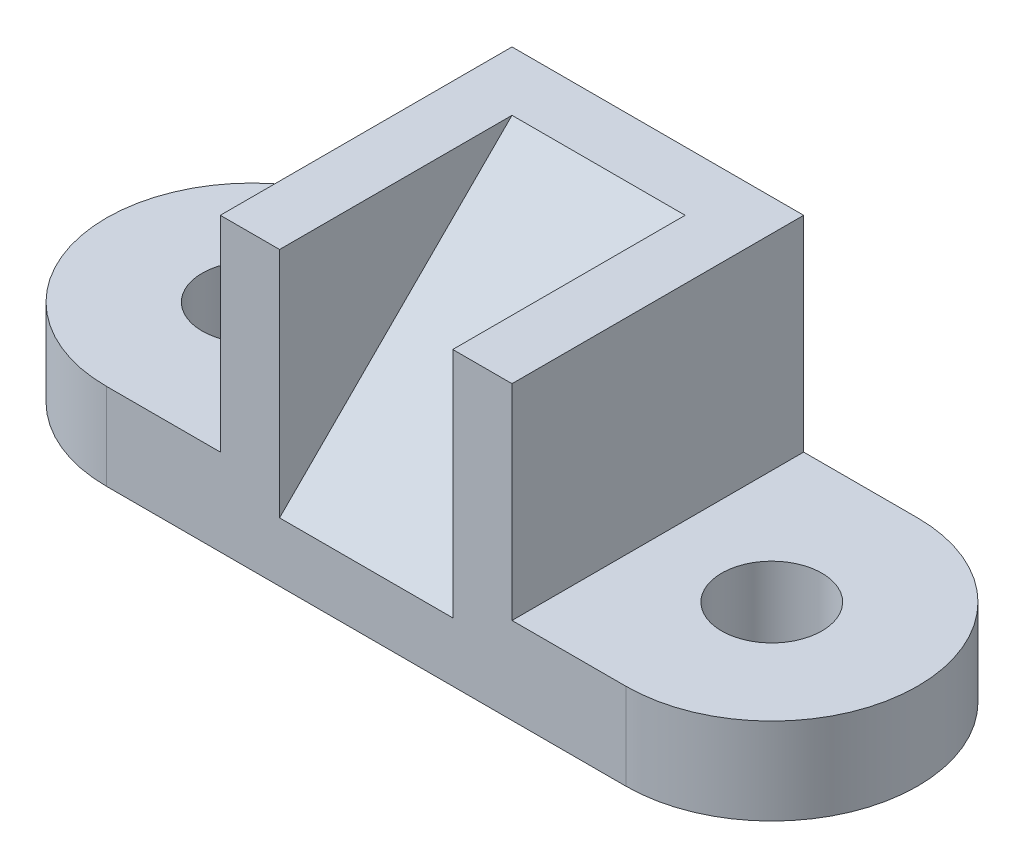
ISO-10303-21;
HEADER;
FILE_DESCRIPTION(('STEP AP214'),'2;1');
FILE_NAME('part.step','',(''),(''),'','','');
FILE_SCHEMA(('AUTOMOTIVE_DESIGN { 1 0 10303 214 1 1 1 1 }'));
ENDSEC;
DATA;
#1=APPLICATION_CONTEXT('core data for automotive mechanical design processes');
#2=APPLICATION_PROTOCOL_DEFINITION('international standard','automotive_design',2000,#1);
#3=PRODUCT_CONTEXT('',#1,'mechanical');
#4=PRODUCT('Part','Part','',(#3));
#5=PRODUCT_RELATED_PRODUCT_CATEGORY('part','',(#4));
#6=PRODUCT_DEFINITION_FORMATION('','',#4);
#7=PRODUCT_DEFINITION_CONTEXT('part definition',#1,'design');
#8=PRODUCT_DEFINITION('design','',#6,#7);
#9=PRODUCT_DEFINITION_SHAPE('','',#8);
#10=(LENGTH_UNIT() NAMED_UNIT(*) SI_UNIT(.MILLI.,.METRE.));
#11=(NAMED_UNIT(*) PLANE_ANGLE_UNIT() SI_UNIT($,.RADIAN.));
#12=(NAMED_UNIT(*) SI_UNIT($,.STERADIAN.) SOLID_ANGLE_UNIT());
#13=UNCERTAINTY_MEASURE_WITH_UNIT(LENGTH_MEASURE(1.E-05),#10,'distance_accuracy_value','');
#14=(GEOMETRIC_REPRESENTATION_CONTEXT(3) GLOBAL_UNCERTAINTY_ASSIGNED_CONTEXT((#13)) GLOBAL_UNIT_ASSIGNED_CONTEXT((#10,
#11,#12)) REPRESENTATION_CONTEXT('',''));
#15=CARTESIAN_POINT('',(0.,0.,0.));
#16=DIRECTION('',(0.,0.,1.));
#17=DIRECTION('',(1.,0.,0.));
#18=AXIS2_PLACEMENT_3D('',#15,#16,#17);
#19=CARTESIAN_POINT('',(57.,19.,0.));
#20=DIRECTION('',(0.,1.,0.));
#21=DIRECTION('',(0.,0.,1.));
#22=AXIS2_PLACEMENT_3D('',#19,#20,#21);
#23=PLANE('',#22);
#24=DIRECTION('',(0.,0.,1.));
#25=VECTOR('',#24,1.);
#26=CARTESIAN_POINT('',(-32.,19.,-32.));
#27=LINE('',#26,#25);
#28=CARTESIAN_POINT('',(-32.,19.,-32.));
#29=VERTEX_POINT('',#28);
#30=CARTESIAN_POINT('',(-32.,19.,32.));
#31=VERTEX_POINT('',#30);
#32=EDGE_CURVE('E144',#29,#31,#27,.T.);
#33=ORIENTED_EDGE('',*,*,#32,.F.);
#34=DIRECTION('',(-1.,0.,0.));
#35=VECTOR('',#34,1.);
#36=CARTESIAN_POINT('',(57.,19.,-32.));
#37=LINE('',#36,#35);
#38=CARTESIAN_POINT('',(-57.,19.,-32.));
#39=VERTEX_POINT('',#38);
#40=EDGE_CURVE('E190',#29,#39,#37,.T.);
#41=ORIENTED_EDGE('',*,*,#40,.T.);
#42=CARTESIAN_POINT('',(-57.,19.,0.));
#43=DIRECTION('',(0.,1.,0.));
#44=DIRECTION('',(0.,0.,1.));
#45=AXIS2_PLACEMENT_3D('',#42,#43,#44);
#46=CIRCLE('',#45,32.);
#47=CARTESIAN_POINT('',(-57.,19.,32.));
#48=VERTEX_POINT('',#47);
#49=EDGE_CURVE('E194',#39,#48,#46,.T.);
#50=ORIENTED_EDGE('',*,*,#49,.T.);
#51=DIRECTION('',(1.,0.,0.));
#52=VECTOR('',#51,1.);
#53=CARTESIAN_POINT('',(57.,19.,32.));
#54=LINE('',#53,#52);
#55=EDGE_CURVE('E197',#48,#31,#54,.T.);
#56=ORIENTED_EDGE('',*,*,#55,.T.);
#57=EDGE_LOOP('',(#33,#41,#50,#56));
#58=FACE_BOUND('',#57,.T.);
#59=CARTESIAN_POINT('',(-57.,19.,0.));
#60=DIRECTION('',(0.,1.,0.));
#61=DIRECTION('',(0.,0.,1.));
#62=AXIS2_PLACEMENT_3D('',#59,#60,#61);
#63=CIRCLE('',#62,11.);
#64=CARTESIAN_POINT('',(-57.,19.,11.));
#65=VERTEX_POINT('',#64);
#66=EDGE_CURVE('E181',#65,#65,#63,.T.);
#67=ORIENTED_EDGE('',*,*,#66,.F.);
#68=EDGE_LOOP('',(#67));
#69=FACE_BOUND('',#68,.T.);
#70=ADVANCED_FACE('F39',(#58,#69),#23,.T.);
#71=DIRECTION('',(0.,0.,-1.));
#72=VECTOR('',#71,1.);
#73=CARTESIAN_POINT('',(32.,19.,-32.));
#74=LINE('',#73,#72);
#75=CARTESIAN_POINT('',(32.,19.,32.));
#76=VERTEX_POINT('',#75);
#77=CARTESIAN_POINT('',(32.,19.,-32.));
#78=VERTEX_POINT('',#77);
#79=EDGE_CURVE('E62',#76,#78,#74,.T.);
#80=ORIENTED_EDGE('',*,*,#79,.F.);
#81=CARTESIAN_POINT('',(57.,19.,32.));
#82=VERTEX_POINT('',#81);
#83=EDGE_CURVE('E196',#76,#82,#54,.T.);
#84=ORIENTED_EDGE('',*,*,#83,.T.);
#85=CARTESIAN_POINT('',(57.,19.,0.));
#86=DIRECTION('',(0.,1.,0.));
#87=DIRECTION('',(0.,0.,1.));
#88=AXIS2_PLACEMENT_3D('',#85,#86,#87);
#89=CIRCLE('',#88,32.);
#90=CARTESIAN_POINT('',(57.,19.,-32.));
#91=VERTEX_POINT('',#90);
#92=EDGE_CURVE('E187',#82,#91,#89,.T.);
#93=ORIENTED_EDGE('',*,*,#92,.T.);
#94=EDGE_CURVE('E192',#91,#78,#37,.T.);
#95=ORIENTED_EDGE('',*,*,#94,.T.);
#96=EDGE_LOOP('',(#80,#84,#93,#95));
#97=FACE_BOUND('',#96,.T.);
#98=CARTESIAN_POINT('',(57.,19.,0.));
#99=DIRECTION('',(0.,1.,0.));
#100=DIRECTION('',(0.,0.,1.));
#101=AXIS2_PLACEMENT_3D('',#98,#99,#100);
#102=CIRCLE('',#101,11.);
#103=CARTESIAN_POINT('',(57.,19.,11.));
#104=VERTEX_POINT('',#103);
#105=EDGE_CURVE('E175',#104,#104,#102,.T.);
#106=ORIENTED_EDGE('',*,*,#105,.F.);
#107=EDGE_LOOP('',(#106));
#108=FACE_BOUND('',#107,.T.);
#109=ADVANCED_FACE('F232',(#97,#108),#23,.T.);
#110=CARTESIAN_POINT('',(57.,0.,0.));
#111=DIRECTION('',(0.,1.,0.));
#112=DIRECTION('',(0.,0.,1.));
#113=AXIS2_PLACEMENT_3D('',#110,#111,#112);
#114=PLANE('',#113);
#115=CARTESIAN_POINT('',(57.,0.,0.));
#116=DIRECTION('',(0.,1.,0.));
#117=DIRECTION('',(0.,0.,1.));
#118=AXIS2_PLACEMENT_3D('',#115,#116,#117);
#119=CIRCLE('',#118,32.);
#120=CARTESIAN_POINT('',(57.,0.,32.));
#121=VERTEX_POINT('',#120);
#122=CARTESIAN_POINT('',(57.,0.,-32.));
#123=VERTEX_POINT('',#122);
#124=EDGE_CURVE('E184',#121,#123,#119,.T.);
#125=ORIENTED_EDGE('',*,*,#124,.F.);
#126=DIRECTION('',(1.,0.,0.));
#127=VECTOR('',#126,1.);
#128=CARTESIAN_POINT('',(57.,0.,32.));
#129=LINE('',#128,#127);
#130=CARTESIAN_POINT('',(-57.,0.,32.));
#131=VERTEX_POINT('',#130);
#132=EDGE_CURVE('E191',#131,#121,#129,.T.);
#133=ORIENTED_EDGE('',*,*,#132,.F.);
#134=CARTESIAN_POINT('',(-57.,0.,0.));
#135=DIRECTION('',(0.,1.,0.));
#136=DIRECTION('',(0.,0.,1.));
#137=AXIS2_PLACEMENT_3D('',#134,#135,#136);
#138=CIRCLE('',#137,32.);
#139=CARTESIAN_POINT('',(-57.,0.,-32.));
#140=VERTEX_POINT('',#139);
#141=EDGE_CURVE('E204',#140,#131,#138,.T.);
#142=ORIENTED_EDGE('',*,*,#141,.F.);
#143=DIRECTION('',(-1.,0.,0.));
#144=VECTOR('',#143,1.);
#145=CARTESIAN_POINT('',(57.,0.,-32.));
#146=LINE('',#145,#144);
#147=EDGE_CURVE('E202',#123,#140,#146,.T.);
#148=ORIENTED_EDGE('',*,*,#147,.F.);
#149=EDGE_LOOP('',(#125,#133,#142,#148));
#150=FACE_BOUND('',#149,.T.);
#151=CARTESIAN_POINT('',(-57.,0.,0.));
#152=DIRECTION('',(0.,1.,0.));
#153=DIRECTION('',(0.,0.,1.));
#154=AXIS2_PLACEMENT_3D('',#151,#152,#153);
#155=CIRCLE('',#154,11.);
#156=CARTESIAN_POINT('',(-57.,0.,11.));
#157=VERTEX_POINT('',#156);
#158=EDGE_CURVE('E178',#157,#157,#155,.T.);
#159=ORIENTED_EDGE('',*,*,#158,.T.);
#160=EDGE_LOOP('',(#159));
#161=FACE_BOUND('',#160,.T.);
#162=CARTESIAN_POINT('',(57.,0.,0.));
#163=DIRECTION('',(0.,1.,0.));
#164=DIRECTION('',(0.,0.,1.));
#165=AXIS2_PLACEMENT_3D('',#162,#163,#164);
#166=CIRCLE('',#165,11.);
#167=CARTESIAN_POINT('',(57.,0.,11.));
#168=VERTEX_POINT('',#167);
#169=EDGE_CURVE('E174',#168,#168,#166,.T.);
#170=ORIENTED_EDGE('',*,*,#169,.T.);
#171=EDGE_LOOP('',(#170));
#172=FACE_BOUND('',#171,.T.);
#173=ADVANCED_FACE('F223',(#150,#161,#172),#114,.F.);
#174=CARTESIAN_POINT('',(57.,19.,0.));
#175=DIRECTION('',(0.,-1.,0.));
#176=DIRECTION('',(0.,0.,-1.));
#177=AXIS2_PLACEMENT_3D('',#174,#175,#176);
#178=CYLINDRICAL_SURFACE('',#177,32.);
#179=ORIENTED_EDGE('',*,*,#124,.T.);
#180=DIRECTION('',(0.,-1.,0.));
#181=VECTOR('',#180,1.);
#182=CARTESIAN_POINT('',(57.,19.,-32.));
#183=LINE('',#182,#181);
#184=EDGE_CURVE('E11',#91,#123,#183,.T.);
#185=ORIENTED_EDGE('',*,*,#184,.F.);
#186=ORIENTED_EDGE('',*,*,#92,.F.);
#187=DIRECTION('',(0.,-1.,0.));
#188=VECTOR('',#187,1.);
#189=CARTESIAN_POINT('',(57.,19.,32.));
#190=LINE('',#189,#188);
#191=EDGE_CURVE('E199',#82,#121,#190,.T.);
#192=ORIENTED_EDGE('',*,*,#191,.T.);
#193=EDGE_LOOP('',(#179,#185,#186,#192));
#194=FACE_BOUND('',#193,.T.);
#195=ADVANCED_FACE('F41',(#194),#178,.T.);
#196=CARTESIAN_POINT('',(57.,19.,-32.));
#197=DIRECTION('',(0.,0.,1.));
#198=DIRECTION('',(1.,0.,0.));
#199=AXIS2_PLACEMENT_3D('',#196,#197,#198);
#200=PLANE('',#199);
#201=ORIENTED_EDGE('',*,*,#147,.T.);
#202=DIRECTION('',(0.,-1.,0.));
#203=VECTOR('',#202,1.);
#204=CARTESIAN_POINT('',(-57.,19.,-32.));
#205=LINE('',#204,#203);
#206=EDGE_CURVE('E47',#39,#140,#205,.T.);
#207=ORIENTED_EDGE('',*,*,#206,.F.);
#208=ORIENTED_EDGE('',*,*,#40,.F.);
#209=DIRECTION('',(0.,-1.,0.));
#210=VECTOR('',#209,1.);
#211=CARTESIAN_POINT('',(-32.,64.,-32.));
#212=LINE('',#211,#210);
#213=CARTESIAN_POINT('',(-32.,64.,-32.));
#214=VERTEX_POINT('',#213);
#215=EDGE_CURVE('E159',#214,#29,#212,.T.);
#216=ORIENTED_EDGE('',*,*,#215,.F.);
#217=DIRECTION('',(-1.,0.,0.));
#218=VECTOR('',#217,1.);
#219=CARTESIAN_POINT('',(32.,64.,-32.));
#220=LINE('',#219,#218);
#221=CARTESIAN_POINT('',(32.,64.,-32.));
#222=VERTEX_POINT('',#221);
#223=EDGE_CURVE('E157',#222,#214,#220,.T.);
#224=ORIENTED_EDGE('',*,*,#223,.F.);
#225=DIRECTION('',(0.,-1.,0.));
#226=VECTOR('',#225,1.);
#227=CARTESIAN_POINT('',(32.,64.,-32.));
#228=LINE('',#227,#226);
#229=EDGE_CURVE('E165',#222,#78,#228,.T.);
#230=ORIENTED_EDGE('',*,*,#229,.T.);
#231=ORIENTED_EDGE('',*,*,#94,.F.);
#232=ORIENTED_EDGE('',*,*,#184,.T.);
#233=EDGE_LOOP('',(#201,#207,#208,#216,#224,#230,#231,#232));
#234=FACE_BOUND('',#233,.T.);
#235=ADVANCED_FACE('F248',(#234),#200,.F.);
#236=CARTESIAN_POINT('',(-57.,19.,0.));
#237=DIRECTION('',(0.,-1.,0.));
#238=DIRECTION('',(0.,0.,-1.));
#239=AXIS2_PLACEMENT_3D('',#236,#237,#238);
#240=CYLINDRICAL_SURFACE('',#239,32.);
#241=ORIENTED_EDGE('',*,*,#141,.T.);
#242=DIRECTION('',(0.,-1.,0.));
#243=VECTOR('',#242,1.);
#244=CARTESIAN_POINT('',(-57.,19.,32.));
#245=LINE('',#244,#243);
#246=EDGE_CURVE('E209',#48,#131,#245,.T.);
#247=ORIENTED_EDGE('',*,*,#246,.F.);
#248=ORIENTED_EDGE('',*,*,#49,.F.);
#249=ORIENTED_EDGE('',*,*,#206,.T.);
#250=EDGE_LOOP('',(#241,#247,#248,#249));
#251=FACE_BOUND('',#250,.T.);
#252=ADVANCED_FACE('F216',(#251),#240,.T.);
#253=CARTESIAN_POINT('',(57.,19.,32.));
#254=DIRECTION('',(0.,0.,-1.));
#255=DIRECTION('',(-1.,0.,0.));
#256=AXIS2_PLACEMENT_3D('',#253,#254,#255);
#257=PLANE('',#256);
#258=DIRECTION('',(1.,0.,0.));
#259=VECTOR('',#258,1.);
#260=CARTESIAN_POINT('',(32.,64.,32.));
#261=LINE('',#260,#259);
#262=CARTESIAN_POINT('',(19.,64.,32.));
#263=VERTEX_POINT('',#262);
#264=CARTESIAN_POINT('',(32.,64.,32.));
#265=VERTEX_POINT('',#264);
#266=EDGE_CURVE('E152',#263,#265,#261,.T.);
#267=ORIENTED_EDGE('',*,*,#266,.F.);
#268=DIRECTION('',(0.,1.,0.));
#269=VECTOR('',#268,1.);
#270=CARTESIAN_POINT('',(19.,13.,32.));
#271=LINE('',#270,#269);
#272=CARTESIAN_POINT('',(19.,13.,32.));
#273=VERTEX_POINT('',#272);
#274=EDGE_CURVE('E131',#273,#263,#271,.T.);
#275=ORIENTED_EDGE('',*,*,#274,.F.);
#276=DIRECTION('',(-1.,0.,0.));
#277=VECTOR('',#276,1.);
#278=CARTESIAN_POINT('',(19.,13.,32.));
#279=LINE('',#278,#277);
#280=CARTESIAN_POINT('',(-19.,13.,32.));
#281=VERTEX_POINT('',#280);
#282=EDGE_CURVE('E128',#273,#281,#279,.T.);
#283=ORIENTED_EDGE('',*,*,#282,.T.);
#284=DIRECTION('',(0.,1.,0.));
#285=VECTOR('',#284,1.);
#286=CARTESIAN_POINT('',(-19.,13.,32.));
#287=LINE('',#286,#285);
#288=CARTESIAN_POINT('',(-19.,64.,32.));
#289=VERTEX_POINT('',#288);
#290=EDGE_CURVE('E138',#281,#289,#287,.T.);
#291=ORIENTED_EDGE('',*,*,#290,.T.);
#292=CARTESIAN_POINT('',(-32.,64.,32.));
#293=VERTEX_POINT('',#292);
#294=EDGE_CURVE('E153',#293,#289,#261,.T.);
#295=ORIENTED_EDGE('',*,*,#294,.F.);
#296=DIRECTION('',(0.,-1.,0.));
#297=VECTOR('',#296,1.);
#298=CARTESIAN_POINT('',(-32.,64.,32.));
#299=LINE('',#298,#297);
#300=EDGE_CURVE('E171',#293,#31,#299,.T.);
#301=ORIENTED_EDGE('',*,*,#300,.T.);
#302=ORIENTED_EDGE('',*,*,#55,.F.);
#303=ORIENTED_EDGE('',*,*,#246,.T.);
#304=ORIENTED_EDGE('',*,*,#132,.T.);
#305=ORIENTED_EDGE('',*,*,#191,.F.);
#306=ORIENTED_EDGE('',*,*,#83,.F.);
#307=DIRECTION('',(0.,-1.,0.));
#308=VECTOR('',#307,1.);
#309=CARTESIAN_POINT('',(32.,64.,32.));
#310=LINE('',#309,#308);
#311=EDGE_CURVE('E168',#265,#76,#310,.T.);
#312=ORIENTED_EDGE('',*,*,#311,.F.);
#313=EDGE_LOOP('',(#267,#275,#283,#291,#295,#301,#302,#303,#304,#305,#306,#312));
#314=FACE_BOUND('',#313,.T.);
#315=ADVANCED_FACE('F227',(#314),#257,.F.);
#316=CARTESIAN_POINT('',(-57.,19.,0.));
#317=DIRECTION('',(0.,-1.,0.));
#318=DIRECTION('',(0.,0.,-1.));
#319=AXIS2_PLACEMENT_3D('',#316,#317,#318);
#320=CYLINDRICAL_SURFACE('',#319,11.);
#321=ORIENTED_EDGE('',*,*,#66,.T.);
#322=EDGE_LOOP('',(#321));
#323=FACE_BOUND('',#322,.T.);
#324=ORIENTED_EDGE('',*,*,#158,.F.);
#325=EDGE_LOOP('',(#324));
#326=FACE_BOUND('',#325,.T.);
#327=ADVANCED_FACE('F264',(#323,#326),#320,.F.);
#328=CARTESIAN_POINT('',(57.,19.,0.));
#329=DIRECTION('',(0.,-1.,0.));
#330=DIRECTION('',(0.,0.,-1.));
#331=AXIS2_PLACEMENT_3D('',#328,#329,#330);
#332=CYLINDRICAL_SURFACE('',#331,11.);
#333=ORIENTED_EDGE('',*,*,#105,.T.);
#334=EDGE_LOOP('',(#333));
#335=FACE_BOUND('',#334,.T.);
#336=ORIENTED_EDGE('',*,*,#169,.F.);
#337=EDGE_LOOP('',(#336));
#338=FACE_BOUND('',#337,.T.);
#339=ADVANCED_FACE('F274',(#335,#338),#332,.F.);
#340=CARTESIAN_POINT('',(-32.,64.,-32.));
#341=DIRECTION('',(1.,0.,0.));
#342=DIRECTION('',(0.,0.,-1.));
#343=AXIS2_PLACEMENT_3D('',#340,#341,#342);
#344=PLANE('',#343);
#345=ORIENTED_EDGE('',*,*,#32,.T.);
#346=ORIENTED_EDGE('',*,*,#300,.F.);
#347=DIRECTION('',(0.,0.,1.));
#348=VECTOR('',#347,1.);
#349=CARTESIAN_POINT('',(-32.,64.,-32.));
#350=LINE('',#349,#348);
#351=EDGE_CURVE('E149',#214,#293,#350,.T.);
#352=ORIENTED_EDGE('',*,*,#351,.F.);
#353=ORIENTED_EDGE('',*,*,#215,.T.);
#354=EDGE_LOOP('',(#345,#346,#352,#353));
#355=FACE_BOUND('',#354,.T.);
#356=ADVANCED_FACE('F245',(#355),#344,.F.);
#357=CARTESIAN_POINT('',(32.,64.,-32.));
#358=DIRECTION('',(-1.,0.,0.));
#359=DIRECTION('',(0.,0.,1.));
#360=AXIS2_PLACEMENT_3D('',#357,#358,#359);
#361=PLANE('',#360);
#362=ORIENTED_EDGE('',*,*,#79,.T.);
#363=ORIENTED_EDGE('',*,*,#229,.F.);
#364=DIRECTION('',(0.,0.,-1.));
#365=VECTOR('',#364,1.);
#366=CARTESIAN_POINT('',(32.,64.,-32.));
#367=LINE('',#366,#365);
#368=EDGE_CURVE('E155',#265,#222,#367,.T.);
#369=ORIENTED_EDGE('',*,*,#368,.F.);
#370=ORIENTED_EDGE('',*,*,#311,.T.);
#371=EDGE_LOOP('',(#362,#363,#369,#370));
#372=FACE_BOUND('',#371,.T.);
#373=ADVANCED_FACE('F237',(#372),#361,.F.);
#374=CARTESIAN_POINT('',(0.,64.,0.));
#375=DIRECTION('',(0.,-1.,0.));
#376=DIRECTION('',(0.,0.,-1.));
#377=AXIS2_PLACEMENT_3D('',#374,#375,#376);
#378=PLANE('',#377);
#379=DIRECTION('',(-1.,0.,0.));
#380=VECTOR('',#379,1.);
#381=CARTESIAN_POINT('',(19.,64.,-19.));
#382=LINE('',#381,#380);
#383=CARTESIAN_POINT('',(19.,64.,-19.));
#384=VERTEX_POINT('',#383);
#385=CARTESIAN_POINT('',(-19.,64.,-19.));
#386=VERTEX_POINT('',#385);
#387=EDGE_CURVE('E125',#384,#386,#382,.T.);
#388=ORIENTED_EDGE('',*,*,#387,.F.);
#389=DIRECTION('',(0.,0.,-1.));
#390=VECTOR('',#389,1.);
#391=CARTESIAN_POINT('',(19.,64.,32.));
#392=LINE('',#391,#390);
#393=EDGE_CURVE('E132',#263,#384,#392,.T.);
#394=ORIENTED_EDGE('',*,*,#393,.F.);
#395=ORIENTED_EDGE('',*,*,#266,.T.);
#396=ORIENTED_EDGE('',*,*,#368,.T.);
#397=ORIENTED_EDGE('',*,*,#223,.T.);
#398=ORIENTED_EDGE('',*,*,#351,.T.);
#399=ORIENTED_EDGE('',*,*,#294,.T.);
#400=DIRECTION('',(0.,0.,-1.));
#401=VECTOR('',#400,1.);
#402=CARTESIAN_POINT('',(-19.,64.,32.));
#403=LINE('',#402,#401);
#404=EDGE_CURVE('E142',#289,#386,#403,.T.);
#405=ORIENTED_EDGE('',*,*,#404,.T.);
#406=EDGE_LOOP('',(#388,#394,#395,#396,#397,#398,#399,#405));
#407=FACE_BOUND('',#406,.T.);
#408=ADVANCED_FACE('F140',(#407),#378,.F.);
#409=CARTESIAN_POINT('',(19.,64.,-19.));
#410=DIRECTION('',(0.,-0.707106781186547,-0.707106781186548));
#411=DIRECTION('',(0.,0.707106781186548,-0.707106781186547));
#412=AXIS2_PLACEMENT_3D('',#409,#410,#411);
#413=PLANE('',#412);
#414=DIRECTION('',(0.,-0.707106781186548,0.707106781186548));
#415=VECTOR('',#414,1.);
#416=CARTESIAN_POINT('',(-19.,64.,-19.));
#417=LINE('',#416,#415);
#418=EDGE_CURVE('E54',#386,#281,#417,.T.);
#419=ORIENTED_EDGE('',*,*,#418,.T.);
#420=ORIENTED_EDGE('',*,*,#282,.F.);
#421=DIRECTION('',(0.,-0.707106781186548,0.707106781186548));
#422=VECTOR('',#421,1.);
#423=CARTESIAN_POINT('',(19.,64.,-19.));
#424=LINE('',#423,#422);
#425=EDGE_CURVE('E121',#384,#273,#424,.T.);
#426=ORIENTED_EDGE('',*,*,#425,.F.);
#427=ORIENTED_EDGE('',*,*,#387,.T.);
#428=EDGE_LOOP('',(#419,#420,#426,#427));
#429=FACE_BOUND('',#428,.T.);
#430=ADVANCED_FACE('F123',(#429),#413,.F.);
#431=CARTESIAN_POINT('',(19.,0.,0.));
#432=DIRECTION('',(1.,0.,0.));
#433=DIRECTION('',(0.,0.,-1.));
#434=AXIS2_PLACEMENT_3D('',#431,#432,#433);
#435=PLANE('',#434);
#436=ORIENTED_EDGE('',*,*,#393,.T.);
#437=ORIENTED_EDGE('',*,*,#425,.T.);
#438=ORIENTED_EDGE('',*,*,#274,.T.);
#439=EDGE_LOOP('',(#436,#437,#438));
#440=FACE_BOUND('',#439,.T.);
#441=ADVANCED_FACE('F135',(#440),#435,.F.);
#442=CARTESIAN_POINT('',(-19.,0.,0.));
#443=DIRECTION('',(1.,0.,0.));
#444=DIRECTION('',(0.,0.,-1.));
#445=AXIS2_PLACEMENT_3D('',#442,#443,#444);
#446=PLANE('',#445);
#447=ORIENTED_EDGE('',*,*,#404,.F.);
#448=ORIENTED_EDGE('',*,*,#290,.F.);
#449=ORIENTED_EDGE('',*,*,#418,.F.);
#450=EDGE_LOOP('',(#447,#448,#449));
#451=FACE_BOUND('',#450,.T.);
#452=ADVANCED_FACE('F293',(#451),#446,.T.);
#453=CLOSED_SHELL('',(#70,#109,#173,#195,#235,#252,#315,#327,#339,#356,#373,#408,#430,#441,#452));
#454=MANIFOLD_SOLID_BREP('B2',#453);
#455=ADVANCED_BREP_SHAPE_REPRESENTATION('',(#18,#454),#14);
#456=SHAPE_DEFINITION_REPRESENTATION(#9,#455);
ENDSEC;
END-ISO-10303-21;
